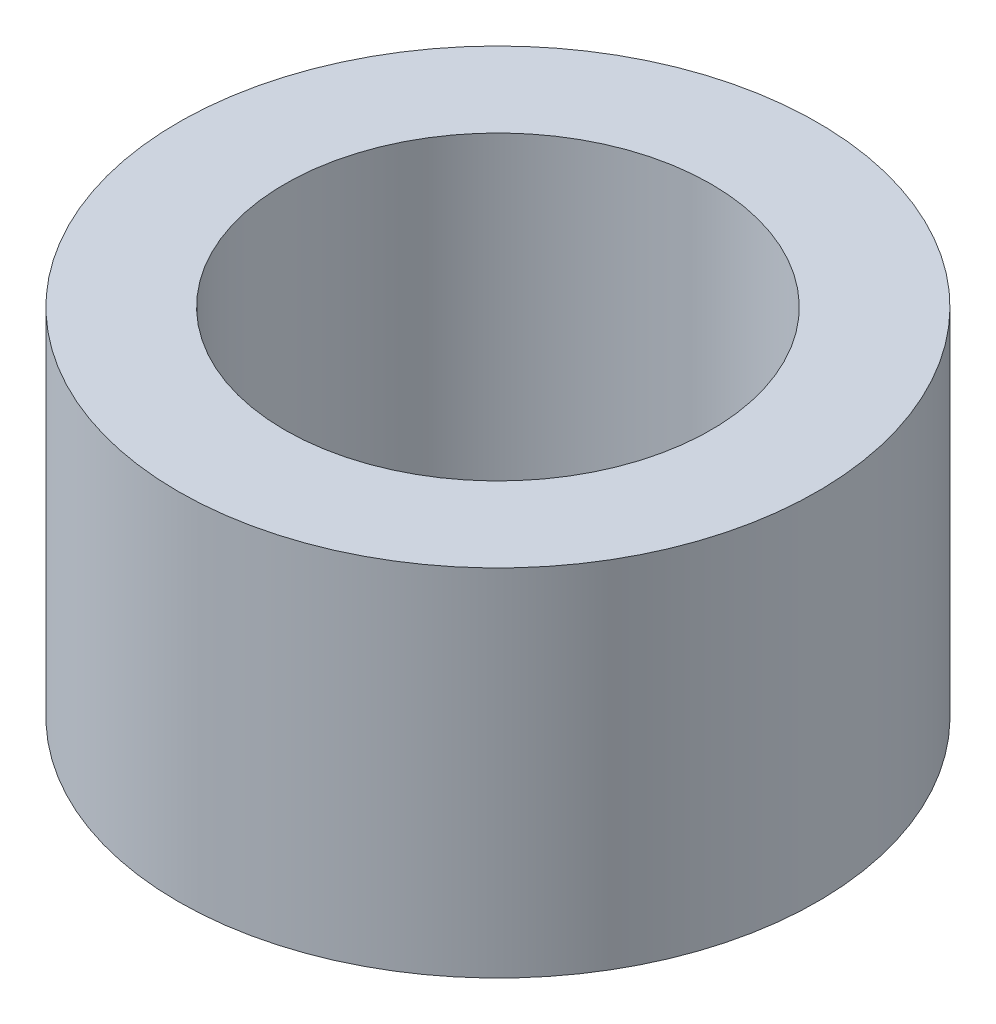
ISO-10303-21;
HEADER;
FILE_DESCRIPTION(('STEP AP214'),'2;1');
FILE_NAME('part.step','',(''),(''),'','','');
FILE_SCHEMA(('AUTOMOTIVE_DESIGN { 1 0 10303 214 1 1 1 1 }'));
ENDSEC;
DATA;
#1=APPLICATION_CONTEXT('core data for automotive mechanical design processes');
#2=APPLICATION_PROTOCOL_DEFINITION('international standard','automotive_design',2000,#1);
#3=PRODUCT_CONTEXT('',#1,'mechanical');
#4=PRODUCT('Part','Part','',(#3));
#5=PRODUCT_RELATED_PRODUCT_CATEGORY('part','',(#4));
#6=PRODUCT_DEFINITION_FORMATION('','',#4);
#7=PRODUCT_DEFINITION_CONTEXT('part definition',#1,'design');
#8=PRODUCT_DEFINITION('design','',#6,#7);
#9=PRODUCT_DEFINITION_SHAPE('','',#8);
#10=(LENGTH_UNIT() NAMED_UNIT(*) SI_UNIT(.MILLI.,.METRE.));
#11=(NAMED_UNIT(*) PLANE_ANGLE_UNIT() SI_UNIT($,.RADIAN.));
#12=(NAMED_UNIT(*) SI_UNIT($,.STERADIAN.) SOLID_ANGLE_UNIT());
#13=UNCERTAINTY_MEASURE_WITH_UNIT(LENGTH_MEASURE(1.E-05),#10,'distance_accuracy_value','');
#14=(GEOMETRIC_REPRESENTATION_CONTEXT(3) GLOBAL_UNCERTAINTY_ASSIGNED_CONTEXT((#13)) GLOBAL_UNIT_ASSIGNED_CONTEXT((#10,
#11,#12)) REPRESENTATION_CONTEXT('',''));
#15=CARTESIAN_POINT('',(0.,0.,0.));
#16=DIRECTION('',(0.,0.,1.));
#17=DIRECTION('',(1.,0.,0.));
#18=AXIS2_PLACEMENT_3D('',#15,#16,#17);
#19=CARTESIAN_POINT('',(0.,10.,0.));
#20=DIRECTION('',(0.,1.,0.));
#21=DIRECTION('',(0.,0.,1.));
#22=AXIS2_PLACEMENT_3D('',#19,#20,#21);
#23=PLANE('',#22);
#24=CARTESIAN_POINT('',(0.,10.,0.));
#25=DIRECTION('',(0.,1.,0.));
#26=DIRECTION('',(0.,0.,1.));
#27=AXIS2_PLACEMENT_3D('',#24,#25,#26);
#28=CIRCLE('',#27,9.);
#29=CARTESIAN_POINT('',(0.,10.,9.));
#30=VERTEX_POINT('',#29);
#31=EDGE_CURVE('E10',#30,#30,#28,.T.);
#32=ORIENTED_EDGE('',*,*,#31,.T.);
#33=EDGE_LOOP('',(#32));
#34=FACE_BOUND('',#33,.T.);
#35=CARTESIAN_POINT('',(0.,10.,0.));
#36=DIRECTION('',(0.,1.,0.));
#37=DIRECTION('',(0.,0.,1.));
#38=AXIS2_PLACEMENT_3D('',#35,#36,#37);
#39=CIRCLE('',#38,6.);
#40=CARTESIAN_POINT('',(0.,10.,6.));
#41=VERTEX_POINT('',#40);
#42=EDGE_CURVE('E45',#41,#41,#39,.T.);
#43=ORIENTED_EDGE('',*,*,#42,.F.);
#44=EDGE_LOOP('',(#43));
#45=FACE_BOUND('',#44,.T.);
#46=ADVANCED_FACE('F34',(#34,#45),#23,.T.);
#47=CARTESIAN_POINT('',(0.,0.,0.));
#48=DIRECTION('',(0.,1.,0.));
#49=DIRECTION('',(0.,0.,1.));
#50=AXIS2_PLACEMENT_3D('',#47,#48,#49);
#51=PLANE('',#50);
#52=CARTESIAN_POINT('',(0.,0.,0.));
#53=DIRECTION('',(0.,1.,0.));
#54=DIRECTION('',(0.,0.,1.));
#55=AXIS2_PLACEMENT_3D('',#52,#53,#54);
#56=CIRCLE('',#55,9.);
#57=CARTESIAN_POINT('',(0.,0.,9.));
#58=VERTEX_POINT('',#57);
#59=EDGE_CURVE('E38',#58,#58,#56,.T.);
#60=ORIENTED_EDGE('',*,*,#59,.F.);
#61=EDGE_LOOP('',(#60));
#62=FACE_BOUND('',#61,.T.);
#63=CARTESIAN_POINT('',(0.,0.,0.));
#64=DIRECTION('',(0.,1.,0.));
#65=DIRECTION('',(0.,0.,1.));
#66=AXIS2_PLACEMENT_3D('',#63,#64,#65);
#67=CIRCLE('',#66,6.);
#68=CARTESIAN_POINT('',(0.,0.,6.));
#69=VERTEX_POINT('',#68);
#70=EDGE_CURVE('E47',#69,#69,#67,.T.);
#71=ORIENTED_EDGE('',*,*,#70,.T.);
#72=EDGE_LOOP('',(#71));
#73=FACE_BOUND('',#72,.T.);
#74=ADVANCED_FACE('F57',(#62,#73),#51,.F.);
#75=CARTESIAN_POINT('',(0.,10.,0.));
#76=DIRECTION('',(0.,-1.,0.));
#77=DIRECTION('',(0.,0.,-1.));
#78=AXIS2_PLACEMENT_3D('',#75,#76,#77);
#79=CYLINDRICAL_SURFACE('',#78,9.);
#80=ORIENTED_EDGE('',*,*,#31,.F.);
#81=EDGE_LOOP('',(#80));
#82=FACE_BOUND('',#81,.T.);
#83=ORIENTED_EDGE('',*,*,#59,.T.);
#84=EDGE_LOOP('',(#83));
#85=FACE_BOUND('',#84,.T.);
#86=ADVANCED_FACE('F36',(#82,#85),#79,.T.);
#87=CARTESIAN_POINT('',(0.,10.,0.));
#88=DIRECTION('',(0.,-1.,0.));
#89=DIRECTION('',(0.,0.,-1.));
#90=AXIS2_PLACEMENT_3D('',#87,#88,#89);
#91=CYLINDRICAL_SURFACE('',#90,6.);
#92=ORIENTED_EDGE('',*,*,#42,.T.);
#93=EDGE_LOOP('',(#92));
#94=FACE_BOUND('',#93,.T.);
#95=ORIENTED_EDGE('',*,*,#70,.F.);
#96=EDGE_LOOP('',(#95));
#97=FACE_BOUND('',#96,.T.);
#98=ADVANCED_FACE('F53',(#94,#97),#91,.F.);
#99=CLOSED_SHELL('',(#46,#74,#86,#98));
#100=MANIFOLD_SOLID_BREP('B2',#99);
#101=ADVANCED_BREP_SHAPE_REPRESENTATION('',(#18,#100),#14);
#102=SHAPE_DEFINITION_REPRESENTATION(#9,#101);
ENDSEC;
END-ISO-10303-21;
